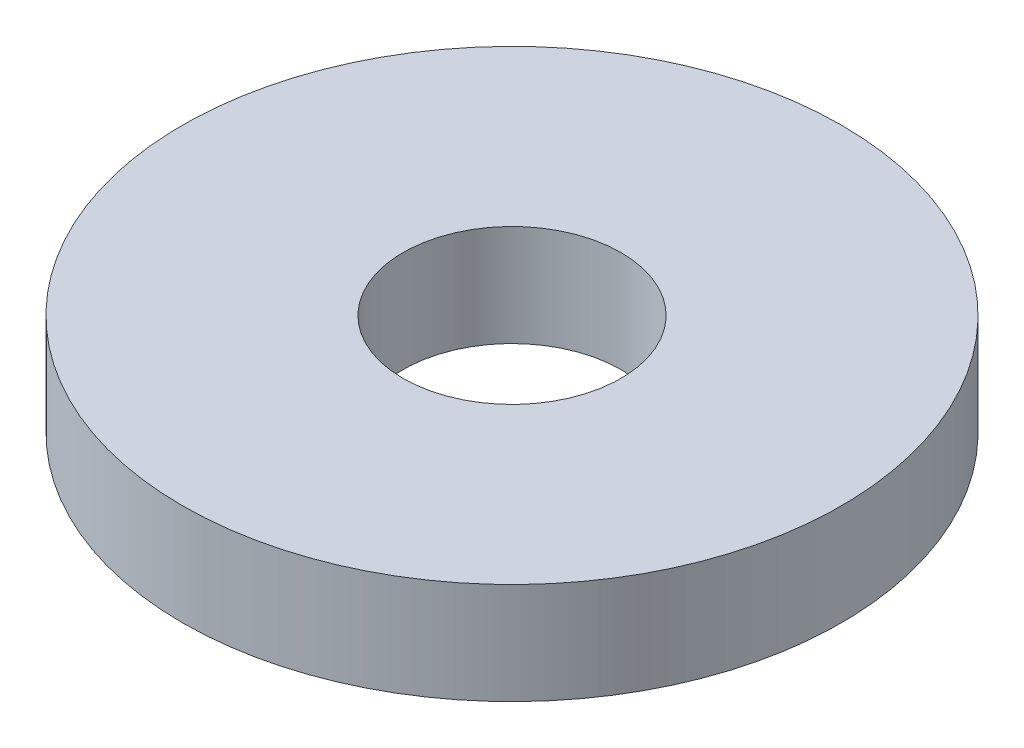
ISO-10303-21;
HEADER;
FILE_DESCRIPTION(('STEP AP214'),'2;1');
FILE_NAME('part.step','',(''),(''),'','','');
FILE_SCHEMA(('AUTOMOTIVE_DESIGN { 1 0 10303 214 1 1 1 1 }'));
ENDSEC;
DATA;
#1=APPLICATION_CONTEXT('core data for automotive mechanical design processes');
#2=APPLICATION_PROTOCOL_DEFINITION('international standard','automotive_design',2000,#1);
#3=PRODUCT_CONTEXT('',#1,'mechanical');
#4=PRODUCT('Part','Part','',(#3));
#5=PRODUCT_RELATED_PRODUCT_CATEGORY('part','',(#4));
#6=PRODUCT_DEFINITION_FORMATION('','',#4);
#7=PRODUCT_DEFINITION_CONTEXT('part definition',#1,'design');
#8=PRODUCT_DEFINITION('design','',#6,#7);
#9=PRODUCT_DEFINITION_SHAPE('','',#8);
#10=(LENGTH_UNIT() NAMED_UNIT(*) SI_UNIT(.MILLI.,.METRE.));
#11=(NAMED_UNIT(*) PLANE_ANGLE_UNIT() SI_UNIT($,.RADIAN.));
#12=(NAMED_UNIT(*) SI_UNIT($,.STERADIAN.) SOLID_ANGLE_UNIT());
#13=UNCERTAINTY_MEASURE_WITH_UNIT(LENGTH_MEASURE(1.E-05),#10,'distance_accuracy_value','');
#14=(GEOMETRIC_REPRESENTATION_CONTEXT(3) GLOBAL_UNCERTAINTY_ASSIGNED_CONTEXT((#13)) GLOBAL_UNIT_ASSIGNED_CONTEXT((#10,
#11,#12)) REPRESENTATION_CONTEXT('',''));
#15=CARTESIAN_POINT('',(0.,0.,0.));
#16=DIRECTION('',(0.,0.,1.));
#17=DIRECTION('',(1.,0.,0.));
#18=AXIS2_PLACEMENT_3D('',#15,#16,#17);
#19=CARTESIAN_POINT('',(0.,2.,0.));
#20=DIRECTION('',(0.,1.,0.));
#21=DIRECTION('',(0.,0.,1.));
#22=AXIS2_PLACEMENT_3D('',#19,#20,#21);
#23=PLANE('',#22);
#24=CARTESIAN_POINT('',(0.,2.,0.));
#25=DIRECTION('',(0.,1.,0.));
#26=DIRECTION('',(0.,0.,1.));
#27=AXIS2_PLACEMENT_3D('',#24,#25,#26);
#28=CIRCLE('',#27,6.5);
#29=CARTESIAN_POINT('',(0.,2.,6.5));
#30=VERTEX_POINT('',#29);
#31=EDGE_CURVE('E10',#30,#30,#28,.T.);
#32=ORIENTED_EDGE('',*,*,#31,.T.);
#33=EDGE_LOOP('',(#32));
#34=FACE_BOUND('',#33,.T.);
#35=CARTESIAN_POINT('',(0.,2.,0.));
#36=DIRECTION('',(0.,1.,0.));
#37=DIRECTION('',(0.,0.,1.));
#38=AXIS2_PLACEMENT_3D('',#35,#36,#37);
#39=CIRCLE('',#38,2.15);
#40=CARTESIAN_POINT('',(0.,2.,2.15));
#41=VERTEX_POINT('',#40);
#42=EDGE_CURVE('E45',#41,#41,#39,.T.);
#43=ORIENTED_EDGE('',*,*,#42,.F.);
#44=EDGE_LOOP('',(#43));
#45=FACE_BOUND('',#44,.T.);
#46=ADVANCED_FACE('F34',(#34,#45),#23,.T.);
#47=CARTESIAN_POINT('',(0.,0.,0.));
#48=DIRECTION('',(0.,1.,0.));
#49=DIRECTION('',(0.,0.,1.));
#50=AXIS2_PLACEMENT_3D('',#47,#48,#49);
#51=PLANE('',#50);
#52=CARTESIAN_POINT('',(0.,0.,0.));
#53=DIRECTION('',(0.,1.,0.));
#54=DIRECTION('',(0.,0.,1.));
#55=AXIS2_PLACEMENT_3D('',#52,#53,#54);
#56=CIRCLE('',#55,6.5);
#57=CARTESIAN_POINT('',(0.,0.,6.5));
#58=VERTEX_POINT('',#57);
#59=EDGE_CURVE('E38',#58,#58,#56,.T.);
#60=ORIENTED_EDGE('',*,*,#59,.F.);
#61=EDGE_LOOP('',(#60));
#62=FACE_BOUND('',#61,.T.);
#63=CARTESIAN_POINT('',(0.,0.,0.));
#64=DIRECTION('',(0.,1.,0.));
#65=DIRECTION('',(0.,0.,1.));
#66=AXIS2_PLACEMENT_3D('',#63,#64,#65);
#67=CIRCLE('',#66,2.15);
#68=CARTESIAN_POINT('',(0.,0.,2.15));
#69=VERTEX_POINT('',#68);
#70=EDGE_CURVE('E47',#69,#69,#67,.T.);
#71=ORIENTED_EDGE('',*,*,#70,.T.);
#72=EDGE_LOOP('',(#71));
#73=FACE_BOUND('',#72,.T.);
#74=ADVANCED_FACE('F57',(#62,#73),#51,.F.);
#75=CARTESIAN_POINT('',(0.,2.,0.));
#76=DIRECTION('',(0.,-1.,0.));
#77=DIRECTION('',(0.,0.,-1.));
#78=AXIS2_PLACEMENT_3D('',#75,#76,#77);
#79=CYLINDRICAL_SURFACE('',#78,6.5);
#80=ORIENTED_EDGE('',*,*,#31,.F.);
#81=EDGE_LOOP('',(#80));
#82=FACE_BOUND('',#81,.T.);
#83=ORIENTED_EDGE('',*,*,#59,.T.);
#84=EDGE_LOOP('',(#83));
#85=FACE_BOUND('',#84,.T.);
#86=ADVANCED_FACE('F36',(#82,#85),#79,.T.);
#87=CARTESIAN_POINT('',(0.,2.,0.));
#88=DIRECTION('',(0.,-1.,0.));
#89=DIRECTION('',(0.,0.,-1.));
#90=AXIS2_PLACEMENT_3D('',#87,#88,#89);
#91=CYLINDRICAL_SURFACE('',#90,2.15);
#92=ORIENTED_EDGE('',*,*,#42,.T.);
#93=EDGE_LOOP('',(#92));
#94=FACE_BOUND('',#93,.T.);
#95=ORIENTED_EDGE('',*,*,#70,.F.);
#96=EDGE_LOOP('',(#95));
#97=FACE_BOUND('',#96,.T.);
#98=ADVANCED_FACE('F53',(#94,#97),#91,.F.);
#99=CLOSED_SHELL('',(#46,#74,#86,#98));
#100=MANIFOLD_SOLID_BREP('B2',#99);
#101=ADVANCED_BREP_SHAPE_REPRESENTATION('',(#18,#100),#14);
#102=SHAPE_DEFINITION_REPRESENTATION(#9,#101);
ENDSEC;
END-ISO-10303-21;
